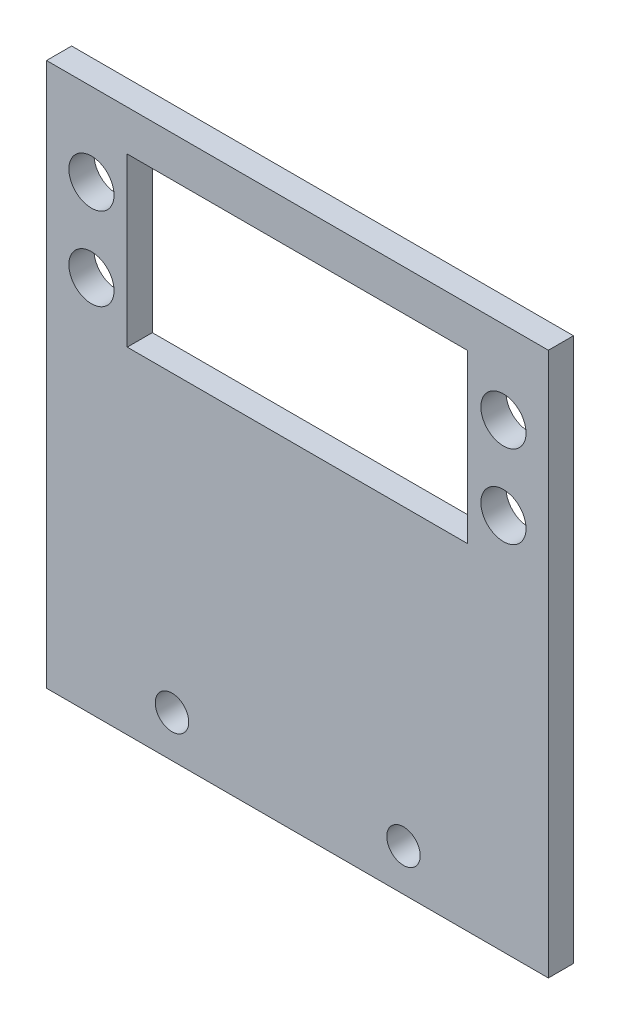
ISO-10303-21;
HEADER;
FILE_DESCRIPTION(('STEP AP214'),'2;1');
FILE_NAME('part.step','',(''),(''),'','','');
FILE_SCHEMA(('AUTOMOTIVE_DESIGN { 1 0 10303 214 1 1 1 1 }'));
ENDSEC;
DATA;
#1=APPLICATION_CONTEXT('core data for automotive mechanical design processes');
#2=APPLICATION_PROTOCOL_DEFINITION('international standard','automotive_design',2000,#1);
#3=PRODUCT_CONTEXT('',#1,'mechanical');
#4=PRODUCT('Part','Part','',(#3));
#5=PRODUCT_RELATED_PRODUCT_CATEGORY('part','',(#4));
#6=PRODUCT_DEFINITION_FORMATION('','',#4);
#7=PRODUCT_DEFINITION_CONTEXT('part definition',#1,'design');
#8=PRODUCT_DEFINITION('design','',#6,#7);
#9=PRODUCT_DEFINITION_SHAPE('','',#8);
#10=(LENGTH_UNIT() NAMED_UNIT(*) SI_UNIT(.MILLI.,.METRE.));
#11=(NAMED_UNIT(*) PLANE_ANGLE_UNIT() SI_UNIT($,.RADIAN.));
#12=(NAMED_UNIT(*) SI_UNIT($,.STERADIAN.) SOLID_ANGLE_UNIT());
#13=UNCERTAINTY_MEASURE_WITH_UNIT(LENGTH_MEASURE(1.E-05),#10,'distance_accuracy_value','');
#14=(GEOMETRIC_REPRESENTATION_CONTEXT(3) GLOBAL_UNCERTAINTY_ASSIGNED_CONTEXT((#13)) GLOBAL_UNIT_ASSIGNED_CONTEXT((#10,
#11,#12)) REPRESENTATION_CONTEXT('',''));
#15=CARTESIAN_POINT('',(0.,0.,0.));
#16=DIRECTION('',(0.,0.,1.));
#17=DIRECTION('',(1.,0.,0.));
#18=AXIS2_PLACEMENT_3D('',#15,#16,#17);
#19=CARTESIAN_POINT('',(0.,0.,3.));
#20=DIRECTION('',(0.,0.,-1.));
#21=DIRECTION('',(-1.,0.,0.));
#22=AXIS2_PLACEMENT_3D('',#19,#20,#21);
#23=PLANE('',#22);
#24=DIRECTION('',(0.,-1.,0.));
#25=VECTOR('',#24,1.);
#26=CARTESIAN_POINT('',(0.,0.,3.));
#27=LINE('',#26,#25);
#28=CARTESIAN_POINT('',(0.,65.,3.));
#29=VERTEX_POINT('',#28);
#30=CARTESIAN_POINT('',(0.,0.,3.));
#31=VERTEX_POINT('',#30);
#32=EDGE_CURVE('E141',#29,#31,#27,.T.);
#33=ORIENTED_EDGE('',*,*,#32,.T.);
#34=DIRECTION('',(1.,0.,0.));
#35=VECTOR('',#34,1.);
#36=CARTESIAN_POINT('',(0.,0.,3.));
#37=LINE('',#36,#35);
#38=CARTESIAN_POINT('',(60.,0.,3.));
#39=VERTEX_POINT('',#38);
#40=EDGE_CURVE('E144',#31,#39,#37,.T.);
#41=ORIENTED_EDGE('',*,*,#40,.T.);
#42=DIRECTION('',(0.,1.,0.));
#43=VECTOR('',#42,1.);
#44=CARTESIAN_POINT('',(60.,0.,3.));
#45=LINE('',#44,#43);
#46=CARTESIAN_POINT('',(60.,65.,3.));
#47=VERTEX_POINT('',#46);
#48=EDGE_CURVE('E147',#39,#47,#45,.T.);
#49=ORIENTED_EDGE('',*,*,#48,.T.);
#50=DIRECTION('',(-1.,0.,0.));
#51=VECTOR('',#50,1.);
#52=CARTESIAN_POINT('',(0.,65.,3.));
#53=LINE('',#52,#51);
#54=EDGE_CURVE('E149',#47,#29,#53,.T.);
#55=ORIENTED_EDGE('',*,*,#54,.T.);
#56=EDGE_LOOP('',(#33,#41,#49,#55));
#57=FACE_BOUND('',#56,.T.);
#58=DIRECTION('',(0.,-1.,0.));
#59=VECTOR('',#58,1.);
#60=CARTESIAN_POINT('',(9.65,40.1452720192717,3.));
#61=LINE('',#60,#59);
#62=CARTESIAN_POINT('',(9.65,60.1452720192718,3.));
#63=VERTEX_POINT('',#62);
#64=CARTESIAN_POINT('',(9.65,40.1452720192717,3.));
#65=VERTEX_POINT('',#64);
#66=EDGE_CURVE('E102',#63,#65,#61,.T.);
#67=ORIENTED_EDGE('',*,*,#66,.F.);
#68=DIRECTION('',(-1.,0.,0.));
#69=VECTOR('',#68,1.);
#70=CARTESIAN_POINT('',(50.35,60.1452720192718,3.));
#71=LINE('',#70,#69);
#72=CARTESIAN_POINT('',(50.35,60.1452720192718,3.));
#73=VERTEX_POINT('',#72);
#74=EDGE_CURVE('E125',#73,#63,#71,.T.);
#75=ORIENTED_EDGE('',*,*,#74,.F.);
#76=DIRECTION('',(0.,1.,0.));
#77=VECTOR('',#76,1.);
#78=CARTESIAN_POINT('',(50.35,40.1452720192717,3.));
#79=LINE('',#78,#77);
#80=CARTESIAN_POINT('',(50.35,40.1452720192717,3.));
#81=VERTEX_POINT('',#80);
#82=EDGE_CURVE('E123',#81,#73,#79,.T.);
#83=ORIENTED_EDGE('',*,*,#82,.F.);
#84=DIRECTION('',(1.,0.,0.));
#85=VECTOR('',#84,1.);
#86=CARTESIAN_POINT('',(50.35,40.1452720192717,3.));
#87=LINE('',#86,#85);
#88=EDGE_CURVE('E110',#65,#81,#87,.T.);
#89=ORIENTED_EDGE('',*,*,#88,.F.);
#90=EDGE_LOOP('',(#67,#75,#83,#89));
#91=FACE_BOUND('',#90,.T.);
#92=CARTESIAN_POINT('',(5.3705852907613,55.0952720192717,3.));
#93=DIRECTION('',(0.,0.,1.));
#94=DIRECTION('',(1.,0.,0.));
#95=AXIS2_PLACEMENT_3D('',#92,#93,#94);
#96=CIRCLE('',#95,2.7);
#97=CARTESIAN_POINT('',(8.0705852907613,55.0952720192717,3.));
#98=VERTEX_POINT('',#97);
#99=EDGE_CURVE('E131',#98,#98,#96,.T.);
#100=ORIENTED_EDGE('',*,*,#99,.F.);
#101=EDGE_LOOP('',(#100));
#102=FACE_BOUND('',#101,.T.);
#103=CARTESIAN_POINT('',(5.3705852907613,45.1952720192717,3.));
#104=DIRECTION('',(0.,0.,1.));
#105=DIRECTION('',(1.,0.,0.));
#106=AXIS2_PLACEMENT_3D('',#103,#104,#105);
#107=CIRCLE('',#106,2.7);
#108=CARTESIAN_POINT('',(8.0705852907613,45.1952720192717,3.));
#109=VERTEX_POINT('',#108);
#110=EDGE_CURVE('E273',#109,#109,#107,.T.);
#111=ORIENTED_EDGE('',*,*,#110,.F.);
#112=EDGE_LOOP('',(#111));
#113=FACE_BOUND('',#112,.T.);
#114=CARTESIAN_POINT('',(54.63,55.0952720192717,3.));
#115=DIRECTION('',(0.,0.,1.));
#116=DIRECTION('',(1.,0.,0.));
#117=AXIS2_PLACEMENT_3D('',#114,#115,#116);
#118=CIRCLE('',#117,2.7);
#119=CARTESIAN_POINT('',(57.33,55.0952720192717,3.));
#120=VERTEX_POINT('',#119);
#121=EDGE_CURVE('E267',#120,#120,#118,.T.);
#122=ORIENTED_EDGE('',*,*,#121,.F.);
#123=EDGE_LOOP('',(#122));
#124=FACE_BOUND('',#123,.T.);
#125=CARTESIAN_POINT('',(54.63,45.1952720192717,3.));
#126=DIRECTION('',(0.,0.,1.));
#127=DIRECTION('',(1.,0.,0.));
#128=AXIS2_PLACEMENT_3D('',#125,#126,#127);
#129=CIRCLE('',#128,2.7);
#130=CARTESIAN_POINT('',(57.33,45.1952720192717,3.));
#131=VERTEX_POINT('',#130);
#132=EDGE_CURVE('E261',#131,#131,#129,.T.);
#133=ORIENTED_EDGE('',*,*,#132,.F.);
#134=EDGE_LOOP('',(#133));
#135=FACE_BOUND('',#134,.T.);
#136=CARTESIAN_POINT('',(15.,5.,3.));
#137=DIRECTION('',(0.,0.,1.));
#138=DIRECTION('',(1.,0.,0.));
#139=AXIS2_PLACEMENT_3D('',#136,#137,#138);
#140=CIRCLE('',#139,2.);
#141=CARTESIAN_POINT('',(17.,5.,3.));
#142=VERTEX_POINT('',#141);
#143=EDGE_CURVE('E255',#142,#142,#140,.T.);
#144=ORIENTED_EDGE('',*,*,#143,.F.);
#145=EDGE_LOOP('',(#144));
#146=FACE_BOUND('',#145,.T.);
#147=CARTESIAN_POINT('',(42.6771711481685,5.,3.));
#148=DIRECTION('',(0.,0.,1.));
#149=DIRECTION('',(1.,0.,0.));
#150=AXIS2_PLACEMENT_3D('',#147,#148,#149);
#151=CIRCLE('',#150,2.);
#152=CARTESIAN_POINT('',(44.6771711481685,5.,3.));
#153=VERTEX_POINT('',#152);
#154=EDGE_CURVE('E246',#153,#153,#151,.T.);
#155=ORIENTED_EDGE('',*,*,#154,.F.);
#156=EDGE_LOOP('',(#155));
#157=FACE_BOUND('',#156,.T.);
#158=ADVANCED_FACE('F37',(#57,#91,#102,#113,#124,#135,#146,#157),#23,.F.);
#159=CARTESIAN_POINT('',(0.,0.,0.));
#160=DIRECTION('',(0.,0.,-1.));
#161=DIRECTION('',(-1.,0.,0.));
#162=AXIS2_PLACEMENT_3D('',#159,#160,#161);
#163=PLANE('',#162);
#164=CARTESIAN_POINT('',(15.,5.,0.));
#165=DIRECTION('',(0.,0.,1.));
#166=DIRECTION('',(1.,0.,0.));
#167=AXIS2_PLACEMENT_3D('',#164,#165,#166);
#168=CIRCLE('',#167,2.);
#169=CARTESIAN_POINT('',(17.,5.,0.));
#170=VERTEX_POINT('',#169);
#171=EDGE_CURVE('E252',#170,#170,#168,.T.);
#172=ORIENTED_EDGE('',*,*,#171,.T.);
#173=EDGE_LOOP('',(#172));
#174=FACE_BOUND('',#173,.T.);
#175=CARTESIAN_POINT('',(54.63,55.0952720192717,0.));
#176=DIRECTION('',(0.,0.,1.));
#177=DIRECTION('',(1.,0.,0.));
#178=AXIS2_PLACEMENT_3D('',#175,#176,#177);
#179=CIRCLE('',#178,2.7);
#180=CARTESIAN_POINT('',(57.33,55.0952720192717,0.));
#181=VERTEX_POINT('',#180);
#182=EDGE_CURVE('E264',#181,#181,#179,.T.);
#183=ORIENTED_EDGE('',*,*,#182,.T.);
#184=EDGE_LOOP('',(#183));
#185=FACE_BOUND('',#184,.T.);
#186=CARTESIAN_POINT('',(5.3705852907613,55.0952720192717,0.));
#187=DIRECTION('',(0.,0.,1.));
#188=DIRECTION('',(1.,0.,0.));
#189=AXIS2_PLACEMENT_3D('',#186,#187,#188);
#190=CIRCLE('',#189,2.7);
#191=CARTESIAN_POINT('',(8.0705852907613,55.0952720192717,0.));
#192=VERTEX_POINT('',#191);
#193=EDGE_CURVE('E276',#192,#192,#190,.T.);
#194=ORIENTED_EDGE('',*,*,#193,.T.);
#195=EDGE_LOOP('',(#194));
#196=FACE_BOUND('',#195,.T.);
#197=DIRECTION('',(0.,-1.,0.));
#198=VECTOR('',#197,1.);
#199=CARTESIAN_POINT('',(0.,0.,0.));
#200=LINE('',#199,#198);
#201=CARTESIAN_POINT('',(0.,65.,0.));
#202=VERTEX_POINT('',#201);
#203=CARTESIAN_POINT('',(0.,0.,0.));
#204=VERTEX_POINT('',#203);
#205=EDGE_CURVE('E118',#202,#204,#200,.T.);
#206=ORIENTED_EDGE('',*,*,#205,.F.);
#207=DIRECTION('',(-1.,0.,0.));
#208=VECTOR('',#207,1.);
#209=CARTESIAN_POINT('',(0.,65.,0.));
#210=LINE('',#209,#208);
#211=CARTESIAN_POINT('',(60.,65.,0.));
#212=VERTEX_POINT('',#211);
#213=EDGE_CURVE('E145',#212,#202,#210,.T.);
#214=ORIENTED_EDGE('',*,*,#213,.F.);
#215=DIRECTION('',(0.,1.,0.));
#216=VECTOR('',#215,1.);
#217=CARTESIAN_POINT('',(60.,0.,0.));
#218=LINE('',#217,#216);
#219=CARTESIAN_POINT('',(60.,0.,0.));
#220=VERTEX_POINT('',#219);
#221=EDGE_CURVE('E156',#220,#212,#218,.T.);
#222=ORIENTED_EDGE('',*,*,#221,.F.);
#223=DIRECTION('',(1.,0.,0.));
#224=VECTOR('',#223,1.);
#225=CARTESIAN_POINT('',(0.,0.,0.));
#226=LINE('',#225,#224);
#227=EDGE_CURVE('E154',#204,#220,#226,.T.);
#228=ORIENTED_EDGE('',*,*,#227,.F.);
#229=EDGE_LOOP('',(#206,#214,#222,#228));
#230=FACE_BOUND('',#229,.T.);
#231=DIRECTION('',(-1.,0.,0.));
#232=VECTOR('',#231,1.);
#233=CARTESIAN_POINT('',(50.35,60.1452720192718,0.));
#234=LINE('',#233,#232);
#235=CARTESIAN_POINT('',(50.35,60.1452720192718,0.));
#236=VERTEX_POINT('',#235);
#237=CARTESIAN_POINT('',(9.65,60.1452720192718,0.));
#238=VERTEX_POINT('',#237);
#239=EDGE_CURVE('E111',#236,#238,#234,.T.);
#240=ORIENTED_EDGE('',*,*,#239,.T.);
#241=DIRECTION('',(0.,-1.,0.));
#242=VECTOR('',#241,1.);
#243=CARTESIAN_POINT('',(9.65,40.1452720192717,0.));
#244=LINE('',#243,#242);
#245=CARTESIAN_POINT('',(9.65,40.1452720192717,0.));
#246=VERTEX_POINT('',#245);
#247=EDGE_CURVE('E60',#238,#246,#244,.T.);
#248=ORIENTED_EDGE('',*,*,#247,.T.);
#249=DIRECTION('',(1.,0.,0.));
#250=VECTOR('',#249,1.);
#251=CARTESIAN_POINT('',(50.35,40.1452720192717,0.));
#252=LINE('',#251,#250);
#253=CARTESIAN_POINT('',(50.35,40.1452720192717,0.));
#254=VERTEX_POINT('',#253);
#255=EDGE_CURVE('E117',#246,#254,#252,.T.);
#256=ORIENTED_EDGE('',*,*,#255,.T.);
#257=DIRECTION('',(0.,1.,0.));
#258=VECTOR('',#257,1.);
#259=CARTESIAN_POINT('',(50.35,40.1452720192717,0.));
#260=LINE('',#259,#258);
#261=EDGE_CURVE('E133',#254,#236,#260,.T.);
#262=ORIENTED_EDGE('',*,*,#261,.T.);
#263=EDGE_LOOP('',(#240,#248,#256,#262));
#264=FACE_BOUND('',#263,.T.);
#265=CARTESIAN_POINT('',(5.3705852907613,45.1952720192717,0.));
#266=DIRECTION('',(0.,0.,1.));
#267=DIRECTION('',(1.,0.,0.));
#268=AXIS2_PLACEMENT_3D('',#265,#266,#267);
#269=CIRCLE('',#268,2.7);
#270=CARTESIAN_POINT('',(8.0705852907613,45.1952720192717,0.));
#271=VERTEX_POINT('',#270);
#272=EDGE_CURVE('E270',#271,#271,#269,.T.);
#273=ORIENTED_EDGE('',*,*,#272,.T.);
#274=EDGE_LOOP('',(#273));
#275=FACE_BOUND('',#274,.T.);
#276=CARTESIAN_POINT('',(54.63,45.1952720192717,0.));
#277=DIRECTION('',(0.,0.,1.));
#278=DIRECTION('',(1.,0.,0.));
#279=AXIS2_PLACEMENT_3D('',#276,#277,#278);
#280=CIRCLE('',#279,2.7);
#281=CARTESIAN_POINT('',(57.33,45.1952720192717,0.));
#282=VERTEX_POINT('',#281);
#283=EDGE_CURVE('E258',#282,#282,#280,.T.);
#284=ORIENTED_EDGE('',*,*,#283,.T.);
#285=EDGE_LOOP('',(#284));
#286=FACE_BOUND('',#285,.T.);
#287=CARTESIAN_POINT('',(42.6771711481685,5.,0.));
#288=DIRECTION('',(0.,0.,1.));
#289=DIRECTION('',(1.,0.,0.));
#290=AXIS2_PLACEMENT_3D('',#287,#288,#289);
#291=CIRCLE('',#290,2.);
#292=CARTESIAN_POINT('',(44.6771711481685,5.,0.));
#293=VERTEX_POINT('',#292);
#294=EDGE_CURVE('E249',#293,#293,#291,.T.);
#295=ORIENTED_EDGE('',*,*,#294,.T.);
#296=EDGE_LOOP('',(#295));
#297=FACE_BOUND('',#296,.T.);
#298=ADVANCED_FACE('F174',(#174,#185,#196,#230,#264,#275,#286,#297),#163,.T.);
#299=CARTESIAN_POINT('',(0.,0.,3.));
#300=DIRECTION('',(1.,0.,0.));
#301=DIRECTION('',(0.,0.,-1.));
#302=AXIS2_PLACEMENT_3D('',#299,#300,#301);
#303=PLANE('',#302);
#304=ORIENTED_EDGE('',*,*,#205,.T.);
#305=DIRECTION('',(0.,0.,-1.));
#306=VECTOR('',#305,1.);
#307=CARTESIAN_POINT('',(0.,0.,3.));
#308=LINE('',#307,#306);
#309=EDGE_CURVE('E11',#31,#204,#308,.T.);
#310=ORIENTED_EDGE('',*,*,#309,.F.);
#311=ORIENTED_EDGE('',*,*,#32,.F.);
#312=DIRECTION('',(0.,0.,-1.));
#313=VECTOR('',#312,1.);
#314=CARTESIAN_POINT('',(0.,65.,3.));
#315=LINE('',#314,#313);
#316=EDGE_CURVE('E151',#29,#202,#315,.T.);
#317=ORIENTED_EDGE('',*,*,#316,.T.);
#318=EDGE_LOOP('',(#304,#310,#311,#317));
#319=FACE_BOUND('',#318,.T.);
#320=ADVANCED_FACE('F39',(#319),#303,.F.);
#321=CARTESIAN_POINT('',(0.,0.,3.));
#322=DIRECTION('',(0.,1.,0.));
#323=DIRECTION('',(0.,0.,1.));
#324=AXIS2_PLACEMENT_3D('',#321,#322,#323);
#325=PLANE('',#324);
#326=ORIENTED_EDGE('',*,*,#227,.T.);
#327=DIRECTION('',(0.,0.,-1.));
#328=VECTOR('',#327,1.);
#329=CARTESIAN_POINT('',(60.,0.,3.));
#330=LINE('',#329,#328);
#331=EDGE_CURVE('E45',#39,#220,#330,.T.);
#332=ORIENTED_EDGE('',*,*,#331,.F.);
#333=ORIENTED_EDGE('',*,*,#40,.F.);
#334=ORIENTED_EDGE('',*,*,#309,.T.);
#335=EDGE_LOOP('',(#326,#332,#333,#334));
#336=FACE_BOUND('',#335,.T.);
#337=ADVANCED_FACE('F184',(#336),#325,.F.);
#338=CARTESIAN_POINT('',(60.,0.,3.));
#339=DIRECTION('',(-1.,0.,0.));
#340=DIRECTION('',(0.,0.,1.));
#341=AXIS2_PLACEMENT_3D('',#338,#339,#340);
#342=PLANE('',#341);
#343=ORIENTED_EDGE('',*,*,#221,.T.);
#344=DIRECTION('',(0.,0.,-1.));
#345=VECTOR('',#344,1.);
#346=CARTESIAN_POINT('',(60.,65.,3.));
#347=LINE('',#346,#345);
#348=EDGE_CURVE('E161',#47,#212,#347,.T.);
#349=ORIENTED_EDGE('',*,*,#348,.F.);
#350=ORIENTED_EDGE('',*,*,#48,.F.);
#351=ORIENTED_EDGE('',*,*,#331,.T.);
#352=EDGE_LOOP('',(#343,#349,#350,#351));
#353=FACE_BOUND('',#352,.T.);
#354=ADVANCED_FACE('F168',(#353),#342,.F.);
#355=CARTESIAN_POINT('',(0.,65.,3.));
#356=DIRECTION('',(0.,-1.,0.));
#357=DIRECTION('',(0.,0.,-1.));
#358=AXIS2_PLACEMENT_3D('',#355,#356,#357);
#359=PLANE('',#358);
#360=ORIENTED_EDGE('',*,*,#213,.T.);
#361=ORIENTED_EDGE('',*,*,#316,.F.);
#362=ORIENTED_EDGE('',*,*,#54,.F.);
#363=ORIENTED_EDGE('',*,*,#348,.T.);
#364=EDGE_LOOP('',(#360,#361,#362,#363));
#365=FACE_BOUND('',#364,.T.);
#366=ADVANCED_FACE('F178',(#365),#359,.F.);
#367=CARTESIAN_POINT('',(9.65,40.1452720192717,3.));
#368=DIRECTION('',(1.,0.,0.));
#369=DIRECTION('',(0.,0.,-1.));
#370=AXIS2_PLACEMENT_3D('',#367,#368,#369);
#371=PLANE('',#370);
#372=ORIENTED_EDGE('',*,*,#247,.F.);
#373=DIRECTION('',(0.,0.,-1.));
#374=VECTOR('',#373,1.);
#375=CARTESIAN_POINT('',(9.65,60.1452720192718,3.));
#376=LINE('',#375,#374);
#377=EDGE_CURVE('E106',#63,#238,#376,.T.);
#378=ORIENTED_EDGE('',*,*,#377,.F.);
#379=ORIENTED_EDGE('',*,*,#66,.T.);
#380=DIRECTION('',(0.,0.,-1.));
#381=VECTOR('',#380,1.);
#382=CARTESIAN_POINT('',(9.65,40.1452720192717,3.));
#383=LINE('',#382,#381);
#384=EDGE_CURVE('E105',#65,#246,#383,.T.);
#385=ORIENTED_EDGE('',*,*,#384,.T.);
#386=EDGE_LOOP('',(#372,#378,#379,#385));
#387=FACE_BOUND('',#386,.T.);
#388=ADVANCED_FACE('F104',(#387),#371,.T.);
#389=CARTESIAN_POINT('',(50.35,40.1452720192717,3.));
#390=DIRECTION('',(0.,1.,0.));
#391=DIRECTION('',(-1.,0.,0.));
#392=AXIS2_PLACEMENT_3D('',#389,#390,#391);
#393=PLANE('',#392);
#394=ORIENTED_EDGE('',*,*,#255,.F.);
#395=ORIENTED_EDGE('',*,*,#384,.F.);
#396=ORIENTED_EDGE('',*,*,#88,.T.);
#397=DIRECTION('',(0.,0.,-1.));
#398=VECTOR('',#397,1.);
#399=CARTESIAN_POINT('',(50.35,40.1452720192717,3.));
#400=LINE('',#399,#398);
#401=EDGE_CURVE('E119',#81,#254,#400,.T.);
#402=ORIENTED_EDGE('',*,*,#401,.T.);
#403=EDGE_LOOP('',(#394,#395,#396,#402));
#404=FACE_BOUND('',#403,.T.);
#405=ADVANCED_FACE('F114',(#404),#393,.T.);
#406=CARTESIAN_POINT('',(50.35,40.1452720192717,3.));
#407=DIRECTION('',(-1.,0.,0.));
#408=DIRECTION('',(0.,0.,1.));
#409=AXIS2_PLACEMENT_3D('',#406,#407,#408);
#410=PLANE('',#409);
#411=ORIENTED_EDGE('',*,*,#261,.F.);
#412=ORIENTED_EDGE('',*,*,#401,.F.);
#413=ORIENTED_EDGE('',*,*,#82,.T.);
#414=DIRECTION('',(0.,0.,-1.));
#415=VECTOR('',#414,1.);
#416=CARTESIAN_POINT('',(50.35,60.1452720192718,3.));
#417=LINE('',#416,#415);
#418=EDGE_CURVE('E52',#73,#236,#417,.T.);
#419=ORIENTED_EDGE('',*,*,#418,.T.);
#420=EDGE_LOOP('',(#411,#412,#413,#419));
#421=FACE_BOUND('',#420,.T.);
#422=ADVANCED_FACE('F208',(#421),#410,.T.);
#423=CARTESIAN_POINT('',(50.35,60.1452720192718,3.));
#424=DIRECTION('',(0.,-1.,0.));
#425=DIRECTION('',(1.,0.,0.));
#426=AXIS2_PLACEMENT_3D('',#423,#424,#425);
#427=PLANE('',#426);
#428=ORIENTED_EDGE('',*,*,#239,.F.);
#429=ORIENTED_EDGE('',*,*,#418,.F.);
#430=ORIENTED_EDGE('',*,*,#74,.T.);
#431=ORIENTED_EDGE('',*,*,#377,.T.);
#432=EDGE_LOOP('',(#428,#429,#430,#431));
#433=FACE_BOUND('',#432,.T.);
#434=ADVANCED_FACE('F212',(#433),#427,.T.);
#435=CARTESIAN_POINT('',(5.3705852907613,55.0952720192717,3.));
#436=DIRECTION('',(0.,0.,-1.));
#437=DIRECTION('',(-1.,0.,0.));
#438=AXIS2_PLACEMENT_3D('',#435,#436,#437);
#439=CYLINDRICAL_SURFACE('',#438,2.7);
#440=ORIENTED_EDGE('',*,*,#99,.T.);
#441=EDGE_LOOP('',(#440));
#442=FACE_BOUND('',#441,.T.);
#443=ORIENTED_EDGE('',*,*,#193,.F.);
#444=EDGE_LOOP('',(#443));
#445=FACE_BOUND('',#444,.T.);
#446=ADVANCED_FACE('F218',(#442,#445),#439,.F.);
#447=CARTESIAN_POINT('',(5.3705852907613,45.1952720192717,3.));
#448=DIRECTION('',(0.,0.,-1.));
#449=DIRECTION('',(-1.,0.,0.));
#450=AXIS2_PLACEMENT_3D('',#447,#448,#449);
#451=CYLINDRICAL_SURFACE('',#450,2.7);
#452=ORIENTED_EDGE('',*,*,#110,.T.);
#453=EDGE_LOOP('',(#452));
#454=FACE_BOUND('',#453,.T.);
#455=ORIENTED_EDGE('',*,*,#272,.F.);
#456=EDGE_LOOP('',(#455));
#457=FACE_BOUND('',#456,.T.);
#458=ADVANCED_FACE('F221',(#454,#457),#451,.F.);
#459=CARTESIAN_POINT('',(54.63,55.0952720192717,3.));
#460=DIRECTION('',(0.,0.,-1.));
#461=DIRECTION('',(-1.,0.,0.));
#462=AXIS2_PLACEMENT_3D('',#459,#460,#461);
#463=CYLINDRICAL_SURFACE('',#462,2.7);
#464=ORIENTED_EDGE('',*,*,#121,.T.);
#465=EDGE_LOOP('',(#464));
#466=FACE_BOUND('',#465,.T.);
#467=ORIENTED_EDGE('',*,*,#182,.F.);
#468=EDGE_LOOP('',(#467));
#469=FACE_BOUND('',#468,.T.);
#470=ADVANCED_FACE('F225',(#466,#469),#463,.F.);
#471=CARTESIAN_POINT('',(54.63,45.1952720192717,3.));
#472=DIRECTION('',(0.,0.,-1.));
#473=DIRECTION('',(-1.,0.,0.));
#474=AXIS2_PLACEMENT_3D('',#471,#472,#473);
#475=CYLINDRICAL_SURFACE('',#474,2.7);
#476=ORIENTED_EDGE('',*,*,#132,.T.);
#477=EDGE_LOOP('',(#476));
#478=FACE_BOUND('',#477,.T.);
#479=ORIENTED_EDGE('',*,*,#283,.F.);
#480=EDGE_LOOP('',(#479));
#481=FACE_BOUND('',#480,.T.);
#482=ADVANCED_FACE('F229',(#478,#481),#475,.F.);
#483=CARTESIAN_POINT('',(15.,5.,3.));
#484=DIRECTION('',(0.,0.,-1.));
#485=DIRECTION('',(-1.,0.,0.));
#486=AXIS2_PLACEMENT_3D('',#483,#484,#485);
#487=CYLINDRICAL_SURFACE('',#486,2.);
#488=ORIENTED_EDGE('',*,*,#143,.T.);
#489=EDGE_LOOP('',(#488));
#490=FACE_BOUND('',#489,.T.);
#491=ORIENTED_EDGE('',*,*,#171,.F.);
#492=EDGE_LOOP('',(#491));
#493=FACE_BOUND('',#492,.T.);
#494=ADVANCED_FACE('F233',(#490,#493),#487,.F.);
#495=CARTESIAN_POINT('',(42.6771711481685,5.,3.));
#496=DIRECTION('',(0.,0.,-1.));
#497=DIRECTION('',(-1.,0.,0.));
#498=AXIS2_PLACEMENT_3D('',#495,#496,#497);
#499=CYLINDRICAL_SURFACE('',#498,2.);
#500=ORIENTED_EDGE('',*,*,#154,.T.);
#501=EDGE_LOOP('',(#500));
#502=FACE_BOUND('',#501,.T.);
#503=ORIENTED_EDGE('',*,*,#294,.F.);
#504=EDGE_LOOP('',(#503));
#505=FACE_BOUND('',#504,.T.);
#506=ADVANCED_FACE('F237',(#502,#505),#499,.F.);
#507=CLOSED_SHELL('',(#158,#298,#320,#337,#354,#366,#388,#405,#422,#434,#446,#458,#470,#482,
#494,#506));
#508=MANIFOLD_SOLID_BREP('B2',#507);
#509=ADVANCED_BREP_SHAPE_REPRESENTATION('',(#18,#508),#14);
#510=SHAPE_DEFINITION_REPRESENTATION(#9,#509);
ENDSEC;
END-ISO-10303-21;
